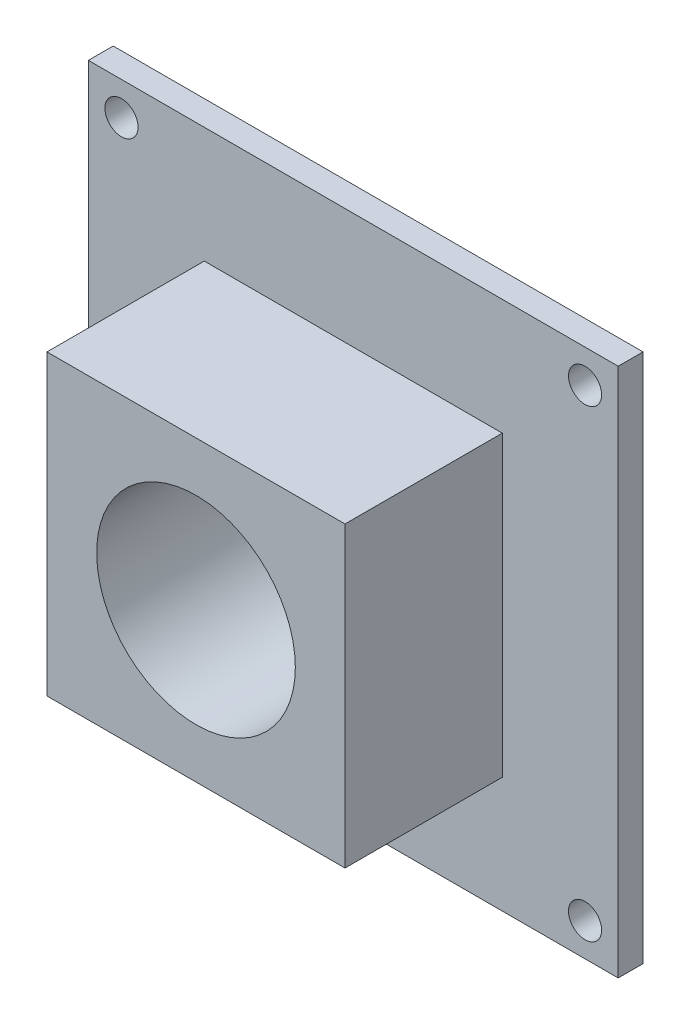
ISO-10303-21;
HEADER;
FILE_DESCRIPTION(('STEP AP214'),'2;1');
FILE_NAME('part.step','',(''),(''),'','','');
FILE_SCHEMA(('AUTOMOTIVE_DESIGN { 1 0 10303 214 1 1 1 1 }'));
ENDSEC;
DATA;
#1=APPLICATION_CONTEXT('core data for automotive mechanical design processes');
#2=APPLICATION_PROTOCOL_DEFINITION('international standard','automotive_design',2000,#1);
#3=PRODUCT_CONTEXT('',#1,'mechanical');
#4=PRODUCT('Part','Part','',(#3));
#5=PRODUCT_RELATED_PRODUCT_CATEGORY('part','',(#4));
#6=PRODUCT_DEFINITION_FORMATION('','',#4);
#7=PRODUCT_DEFINITION_CONTEXT('part definition',#1,'design');
#8=PRODUCT_DEFINITION('design','',#6,#7);
#9=PRODUCT_DEFINITION_SHAPE('','',#8);
#10=(LENGTH_UNIT() NAMED_UNIT(*) SI_UNIT(.MILLI.,.METRE.));
#11=(NAMED_UNIT(*) PLANE_ANGLE_UNIT() SI_UNIT($,.RADIAN.));
#12=(NAMED_UNIT(*) SI_UNIT($,.STERADIAN.) SOLID_ANGLE_UNIT());
#13=UNCERTAINTY_MEASURE_WITH_UNIT(LENGTH_MEASURE(1.E-05),#10,'distance_accuracy_value','');
#14=(GEOMETRIC_REPRESENTATION_CONTEXT(3) GLOBAL_UNCERTAINTY_ASSIGNED_CONTEXT((#13)) GLOBAL_UNIT_ASSIGNED_CONTEXT((#10,
#11,#12)) REPRESENTATION_CONTEXT('',''));
#15=CARTESIAN_POINT('',(0.,0.,0.));
#16=DIRECTION('',(0.,0.,1.));
#17=DIRECTION('',(1.,0.,0.));
#18=AXIS2_PLACEMENT_3D('',#15,#16,#17);
#19=CARTESIAN_POINT('',(0.,0.,1.5));
#20=DIRECTION('',(0.,0.,1.));
#21=DIRECTION('',(1.,0.,0.));
#22=AXIS2_PLACEMENT_3D('',#19,#20,#21);
#23=PLANE('',#22);
#24=DIRECTION('',(1.,0.,0.));
#25=VECTOR('',#24,1.);
#26=CARTESIAN_POINT('',(9.,-9.,1.5));
#27=LINE('',#26,#25);
#28=CARTESIAN_POINT('',(-9.,-9.00000000000001,1.5));
#29=VERTEX_POINT('',#28);
#30=CARTESIAN_POINT('',(9.,-9.,1.5));
#31=VERTEX_POINT('',#30);
#32=EDGE_CURVE('E358',#29,#31,#27,.T.);
#33=ORIENTED_EDGE('',*,*,#32,.F.);
#34=DIRECTION('',(0.,-1.,0.));
#35=VECTOR('',#34,1.);
#36=CARTESIAN_POINT('',(-9.,-9.00000000000001,1.5));
#37=LINE('',#36,#35);
#38=CARTESIAN_POINT('',(-9.,9.,1.5));
#39=VERTEX_POINT('',#38);
#40=EDGE_CURVE('E132',#39,#29,#37,.T.);
#41=ORIENTED_EDGE('',*,*,#40,.F.);
#42=DIRECTION('',(-1.,0.,0.));
#43=VECTOR('',#42,1.);
#44=CARTESIAN_POINT('',(9.,9.,1.5));
#45=LINE('',#44,#43);
#46=CARTESIAN_POINT('',(9.,9.,1.5));
#47=VERTEX_POINT('',#46);
#48=EDGE_CURVE('E128',#47,#39,#45,.T.);
#49=ORIENTED_EDGE('',*,*,#48,.F.);
#50=DIRECTION('',(0.,1.,0.));
#51=VECTOR('',#50,1.);
#52=CARTESIAN_POINT('',(9.,-9.,1.5));
#53=LINE('',#52,#51);
#54=EDGE_CURVE('E365',#31,#47,#53,.T.);
#55=ORIENTED_EDGE('',*,*,#54,.F.);
#56=EDGE_LOOP('',(#33,#41,#49,#55));
#57=FACE_BOUND('',#56,.T.);
#58=CARTESIAN_POINT('',(14.,-14.,1.5));
#59=DIRECTION('',(0.,0.,1.));
#60=DIRECTION('',(1.,0.,0.));
#61=AXIS2_PLACEMENT_3D('',#58,#59,#60);
#62=CIRCLE('',#61,1.);
#63=CARTESIAN_POINT('',(15.,-14.,1.5));
#64=VERTEX_POINT('',#63);
#65=EDGE_CURVE('E145',#64,#64,#62,.T.);
#66=ORIENTED_EDGE('',*,*,#65,.F.);
#67=EDGE_LOOP('',(#66));
#68=FACE_BOUND('',#67,.T.);
#69=CARTESIAN_POINT('',(-14.,14.,1.5));
#70=DIRECTION('',(0.,0.,1.));
#71=DIRECTION('',(1.,0.,0.));
#72=AXIS2_PLACEMENT_3D('',#69,#70,#71);
#73=CIRCLE('',#72,0.999999999999999);
#74=CARTESIAN_POINT('',(-13.,14.,1.5));
#75=VERTEX_POINT('',#74);
#76=EDGE_CURVE('E157',#75,#75,#73,.T.);
#77=ORIENTED_EDGE('',*,*,#76,.F.);
#78=EDGE_LOOP('',(#77));
#79=FACE_BOUND('',#78,.T.);
#80=DIRECTION('',(0.,-1.,0.));
#81=VECTOR('',#80,1.);
#82=CARTESIAN_POINT('',(-16.,-16.,1.5));
#83=LINE('',#82,#81);
#84=CARTESIAN_POINT('',(-16.,16.,1.5));
#85=VERTEX_POINT('',#84);
#86=CARTESIAN_POINT('',(-16.,-16.,1.5));
#87=VERTEX_POINT('',#86);
#88=EDGE_CURVE('E163',#85,#87,#83,.T.);
#89=ORIENTED_EDGE('',*,*,#88,.T.);
#90=DIRECTION('',(1.,0.,0.));
#91=VECTOR('',#90,1.);
#92=CARTESIAN_POINT('',(16.,-16.,1.5));
#93=LINE('',#92,#91);
#94=CARTESIAN_POINT('',(16.,-16.,1.5));
#95=VERTEX_POINT('',#94);
#96=EDGE_CURVE('E86',#87,#95,#93,.T.);
#97=ORIENTED_EDGE('',*,*,#96,.T.);
#98=DIRECTION('',(0.,1.,0.));
#99=VECTOR('',#98,1.);
#100=CARTESIAN_POINT('',(16.,-16.,1.5));
#101=LINE('',#100,#99);
#102=CARTESIAN_POINT('',(16.,16.,1.5));
#103=VERTEX_POINT('',#102);
#104=EDGE_CURVE('E166',#95,#103,#101,.T.);
#105=ORIENTED_EDGE('',*,*,#104,.T.);
#106=DIRECTION('',(-1.,0.,0.));
#107=VECTOR('',#106,1.);
#108=CARTESIAN_POINT('',(16.,16.,1.5));
#109=LINE('',#108,#107);
#110=EDGE_CURVE('E57',#103,#85,#109,.T.);
#111=ORIENTED_EDGE('',*,*,#110,.T.);
#112=EDGE_LOOP('',(#89,#97,#105,#111));
#113=FACE_BOUND('',#112,.T.);
#114=CARTESIAN_POINT('',(14.,14.,1.5));
#115=DIRECTION('',(0.,0.,1.));
#116=DIRECTION('',(1.,0.,0.));
#117=AXIS2_PLACEMENT_3D('',#114,#115,#116);
#118=CIRCLE('',#117,1.);
#119=CARTESIAN_POINT('',(15.,14.,1.5));
#120=VERTEX_POINT('',#119);
#121=EDGE_CURVE('E151',#120,#120,#118,.T.);
#122=ORIENTED_EDGE('',*,*,#121,.F.);
#123=EDGE_LOOP('',(#122));
#124=FACE_BOUND('',#123,.T.);
#125=CARTESIAN_POINT('',(-14.,-14.,1.5));
#126=DIRECTION('',(0.,0.,1.));
#127=DIRECTION('',(1.,0.,0.));
#128=AXIS2_PLACEMENT_3D('',#125,#126,#127);
#129=CIRCLE('',#128,0.999999999999999);
#130=CARTESIAN_POINT('',(-13.,-14.,1.5));
#131=VERTEX_POINT('',#130);
#132=EDGE_CURVE('E137',#131,#131,#129,.T.);
#133=ORIENTED_EDGE('',*,*,#132,.F.);
#134=EDGE_LOOP('',(#133));
#135=FACE_BOUND('',#134,.T.);
#136=ADVANCED_FACE('F33',(#57,#68,#79,#113,#124,#135),#23,.T.);
#137=CARTESIAN_POINT('',(0.,0.,0.));
#138=DIRECTION('',(0.,0.,1.));
#139=DIRECTION('',(1.,0.,0.));
#140=AXIS2_PLACEMENT_3D('',#137,#138,#139);
#141=PLANE('',#140);
#142=DIRECTION('',(0.,-1.,0.));
#143=VECTOR('',#142,1.);
#144=CARTESIAN_POINT('',(-16.,-16.,0.));
#145=LINE('',#144,#143);
#146=CARTESIAN_POINT('',(-16.,16.,0.));
#147=VERTEX_POINT('',#146);
#148=CARTESIAN_POINT('',(-16.,-16.,0.));
#149=VERTEX_POINT('',#148);
#150=EDGE_CURVE('E160',#147,#149,#145,.T.);
#151=ORIENTED_EDGE('',*,*,#150,.F.);
#152=DIRECTION('',(-1.,0.,0.));
#153=VECTOR('',#152,1.);
#154=CARTESIAN_POINT('',(16.,16.,0.));
#155=LINE('',#154,#153);
#156=CARTESIAN_POINT('',(16.,16.,0.));
#157=VERTEX_POINT('',#156);
#158=EDGE_CURVE('E78',#157,#147,#155,.T.);
#159=ORIENTED_EDGE('',*,*,#158,.F.);
#160=DIRECTION('',(0.,1.,0.));
#161=VECTOR('',#160,1.);
#162=CARTESIAN_POINT('',(16.,-16.,0.));
#163=LINE('',#162,#161);
#164=CARTESIAN_POINT('',(16.,-16.,0.));
#165=VERTEX_POINT('',#164);
#166=EDGE_CURVE('E174',#165,#157,#163,.T.);
#167=ORIENTED_EDGE('',*,*,#166,.F.);
#168=DIRECTION('',(1.,0.,0.));
#169=VECTOR('',#168,1.);
#170=CARTESIAN_POINT('',(16.,-16.,0.));
#171=LINE('',#170,#169);
#172=EDGE_CURVE('E172',#149,#165,#171,.T.);
#173=ORIENTED_EDGE('',*,*,#172,.F.);
#174=EDGE_LOOP('',(#151,#159,#167,#173));
#175=FACE_BOUND('',#174,.T.);
#176=CARTESIAN_POINT('',(-14.,14.,0.));
#177=DIRECTION('',(0.,0.,1.));
#178=DIRECTION('',(1.,0.,0.));
#179=AXIS2_PLACEMENT_3D('',#176,#177,#178);
#180=CIRCLE('',#179,0.999999999999999);
#181=CARTESIAN_POINT('',(-13.,14.,0.));
#182=VERTEX_POINT('',#181);
#183=EDGE_CURVE('E154',#182,#182,#180,.T.);
#184=ORIENTED_EDGE('',*,*,#183,.T.);
#185=EDGE_LOOP('',(#184));
#186=FACE_BOUND('',#185,.T.);
#187=CARTESIAN_POINT('',(14.,14.,0.));
#188=DIRECTION('',(0.,0.,1.));
#189=DIRECTION('',(1.,0.,0.));
#190=AXIS2_PLACEMENT_3D('',#187,#188,#189);
#191=CIRCLE('',#190,1.);
#192=CARTESIAN_POINT('',(15.,14.,0.));
#193=VERTEX_POINT('',#192);
#194=EDGE_CURVE('E148',#193,#193,#191,.T.);
#195=ORIENTED_EDGE('',*,*,#194,.T.);
#196=EDGE_LOOP('',(#195));
#197=FACE_BOUND('',#196,.T.);
#198=CARTESIAN_POINT('',(14.,-14.,0.));
#199=DIRECTION('',(0.,0.,1.));
#200=DIRECTION('',(1.,0.,0.));
#201=AXIS2_PLACEMENT_3D('',#198,#199,#200);
#202=CIRCLE('',#201,1.);
#203=CARTESIAN_POINT('',(15.,-14.,0.));
#204=VERTEX_POINT('',#203);
#205=EDGE_CURVE('E143',#204,#204,#202,.T.);
#206=ORIENTED_EDGE('',*,*,#205,.T.);
#207=EDGE_LOOP('',(#206));
#208=FACE_BOUND('',#207,.T.);
#209=CARTESIAN_POINT('',(-14.,-14.,0.));
#210=DIRECTION('',(0.,0.,1.));
#211=DIRECTION('',(1.,0.,0.));
#212=AXIS2_PLACEMENT_3D('',#209,#210,#211);
#213=CIRCLE('',#212,0.999999999999999);
#214=CARTESIAN_POINT('',(-13.,-14.,0.));
#215=VERTEX_POINT('',#214);
#216=EDGE_CURVE('E134',#215,#215,#213,.T.);
#217=ORIENTED_EDGE('',*,*,#216,.T.);
#218=EDGE_LOOP('',(#217));
#219=FACE_BOUND('',#218,.T.);
#220=ADVANCED_FACE('F188',(#175,#186,#197,#208,#219),#141,.F.);
#221=CARTESIAN_POINT('',(-16.,-16.,1.5));
#222=DIRECTION('',(1.,0.,0.));
#223=DIRECTION('',(0.,0.,-1.));
#224=AXIS2_PLACEMENT_3D('',#221,#222,#223);
#225=PLANE('',#224);
#226=ORIENTED_EDGE('',*,*,#150,.T.);
#227=DIRECTION('',(0.,0.,-1.));
#228=VECTOR('',#227,1.);
#229=CARTESIAN_POINT('',(-16.,-16.,1.5));
#230=LINE('',#229,#228);
#231=EDGE_CURVE('E41',#87,#149,#230,.T.);
#232=ORIENTED_EDGE('',*,*,#231,.F.);
#233=ORIENTED_EDGE('',*,*,#88,.F.);
#234=DIRECTION('',(0.,0.,-1.));
#235=VECTOR('',#234,1.);
#236=CARTESIAN_POINT('',(-16.,16.,1.5));
#237=LINE('',#236,#235);
#238=EDGE_CURVE('E169',#85,#147,#237,.T.);
#239=ORIENTED_EDGE('',*,*,#238,.T.);
#240=EDGE_LOOP('',(#226,#232,#233,#239));
#241=FACE_BOUND('',#240,.T.);
#242=ADVANCED_FACE('F35',(#241),#225,.F.);
#243=CARTESIAN_POINT('',(16.,-16.,1.5));
#244=DIRECTION('',(0.,1.,0.));
#245=DIRECTION('',(-1.,0.,0.));
#246=AXIS2_PLACEMENT_3D('',#243,#244,#245);
#247=PLANE('',#246);
#248=ORIENTED_EDGE('',*,*,#172,.T.);
#249=DIRECTION('',(0.,0.,-1.));
#250=VECTOR('',#249,1.);
#251=CARTESIAN_POINT('',(16.,-16.,1.5));
#252=LINE('',#251,#250);
#253=EDGE_CURVE('E180',#95,#165,#252,.T.);
#254=ORIENTED_EDGE('',*,*,#253,.F.);
#255=ORIENTED_EDGE('',*,*,#96,.F.);
#256=ORIENTED_EDGE('',*,*,#231,.T.);
#257=EDGE_LOOP('',(#248,#254,#255,#256));
#258=FACE_BOUND('',#257,.T.);
#259=ADVANCED_FACE('F183',(#258),#247,.F.);
#260=CARTESIAN_POINT('',(16.,-16.,1.5));
#261=DIRECTION('',(-1.,0.,0.));
#262=DIRECTION('',(0.,0.,1.));
#263=AXIS2_PLACEMENT_3D('',#260,#261,#262);
#264=PLANE('',#263);
#265=ORIENTED_EDGE('',*,*,#166,.T.);
#266=DIRECTION('',(0.,0.,-1.));
#267=VECTOR('',#266,1.);
#268=CARTESIAN_POINT('',(16.,16.,1.5));
#269=LINE('',#268,#267);
#270=EDGE_CURVE('E178',#103,#157,#269,.T.);
#271=ORIENTED_EDGE('',*,*,#270,.F.);
#272=ORIENTED_EDGE('',*,*,#104,.F.);
#273=ORIENTED_EDGE('',*,*,#253,.T.);
#274=EDGE_LOOP('',(#265,#271,#272,#273));
#275=FACE_BOUND('',#274,.T.);
#276=ADVANCED_FACE('F193',(#275),#264,.F.);
#277=CARTESIAN_POINT('',(16.,16.,1.5));
#278=DIRECTION('',(0.,-1.,0.));
#279=DIRECTION('',(1.,0.,0.));
#280=AXIS2_PLACEMENT_3D('',#277,#278,#279);
#281=PLANE('',#280);
#282=ORIENTED_EDGE('',*,*,#158,.T.);
#283=ORIENTED_EDGE('',*,*,#238,.F.);
#284=ORIENTED_EDGE('',*,*,#110,.F.);
#285=ORIENTED_EDGE('',*,*,#270,.T.);
#286=EDGE_LOOP('',(#282,#283,#284,#285));
#287=FACE_BOUND('',#286,.T.);
#288=ADVANCED_FACE('F195',(#287),#281,.F.);
#289=CARTESIAN_POINT('',(-14.,14.,1.5));
#290=DIRECTION('',(0.,0.,-1.));
#291=DIRECTION('',(-1.,0.,0.));
#292=AXIS2_PLACEMENT_3D('',#289,#290,#291);
#293=CYLINDRICAL_SURFACE('',#292,0.999999999999999);
#294=ORIENTED_EDGE('',*,*,#76,.T.);
#295=EDGE_LOOP('',(#294));
#296=FACE_BOUND('',#295,.T.);
#297=ORIENTED_EDGE('',*,*,#183,.F.);
#298=EDGE_LOOP('',(#297));
#299=FACE_BOUND('',#298,.T.);
#300=ADVANCED_FACE('F221',(#296,#299),#293,.F.);
#301=CARTESIAN_POINT('',(14.,14.,1.5));
#302=DIRECTION('',(0.,0.,-1.));
#303=DIRECTION('',(-1.,0.,0.));
#304=AXIS2_PLACEMENT_3D('',#301,#302,#303);
#305=CYLINDRICAL_SURFACE('',#304,1.);
#306=ORIENTED_EDGE('',*,*,#121,.T.);
#307=EDGE_LOOP('',(#306));
#308=FACE_BOUND('',#307,.T.);
#309=ORIENTED_EDGE('',*,*,#194,.F.);
#310=EDGE_LOOP('',(#309));
#311=FACE_BOUND('',#310,.T.);
#312=ADVANCED_FACE('F242',(#308,#311),#305,.F.);
#313=CARTESIAN_POINT('',(14.,-14.,1.5));
#314=DIRECTION('',(0.,0.,-1.));
#315=DIRECTION('',(-1.,0.,0.));
#316=AXIS2_PLACEMENT_3D('',#313,#314,#315);
#317=CYLINDRICAL_SURFACE('',#316,1.);
#318=ORIENTED_EDGE('',*,*,#65,.T.);
#319=EDGE_LOOP('',(#318));
#320=FACE_BOUND('',#319,.T.);
#321=ORIENTED_EDGE('',*,*,#205,.F.);
#322=EDGE_LOOP('',(#321));
#323=FACE_BOUND('',#322,.T.);
#324=ADVANCED_FACE('F208',(#320,#323),#317,.F.);
#325=CARTESIAN_POINT('',(-14.,-14.,1.5));
#326=DIRECTION('',(0.,0.,-1.));
#327=DIRECTION('',(-1.,0.,0.));
#328=AXIS2_PLACEMENT_3D('',#325,#326,#327);
#329=CYLINDRICAL_SURFACE('',#328,0.999999999999999);
#330=ORIENTED_EDGE('',*,*,#132,.T.);
#331=EDGE_LOOP('',(#330));
#332=FACE_BOUND('',#331,.T.);
#333=ORIENTED_EDGE('',*,*,#216,.F.);
#334=EDGE_LOOP('',(#333));
#335=FACE_BOUND('',#334,.T.);
#336=ADVANCED_FACE('F205',(#332,#335),#329,.F.);
#337=CARTESIAN_POINT('',(0.,0.,11.));
#338=DIRECTION('',(0.,0.,1.));
#339=DIRECTION('',(1.,0.,0.));
#340=AXIS2_PLACEMENT_3D('',#337,#338,#339);
#341=PLANE('',#340);
#342=DIRECTION('',(0.,-1.,0.));
#343=VECTOR('',#342,1.);
#344=CARTESIAN_POINT('',(-9.,-9.00000000000001,11.));
#345=LINE('',#344,#343);
#346=CARTESIAN_POINT('',(-9.,9.,11.));
#347=VERTEX_POINT('',#346);
#348=CARTESIAN_POINT('',(-9.,-9.00000000000001,11.));
#349=VERTEX_POINT('',#348);
#350=EDGE_CURVE('E119',#347,#349,#345,.T.);
#351=ORIENTED_EDGE('',*,*,#350,.T.);
#352=DIRECTION('',(1.,0.,0.));
#353=VECTOR('',#352,1.);
#354=CARTESIAN_POINT('',(9.,-9.,11.));
#355=LINE('',#354,#353);
#356=CARTESIAN_POINT('',(9.,-9.,11.));
#357=VERTEX_POINT('',#356);
#358=EDGE_CURVE('E108',#349,#357,#355,.T.);
#359=ORIENTED_EDGE('',*,*,#358,.T.);
#360=DIRECTION('',(0.,1.,0.));
#361=VECTOR('',#360,1.);
#362=CARTESIAN_POINT('',(9.,-9.,11.));
#363=LINE('',#362,#361);
#364=CARTESIAN_POINT('',(9.,9.,11.));
#365=VERTEX_POINT('',#364);
#366=EDGE_CURVE('E118',#357,#365,#363,.T.);
#367=ORIENTED_EDGE('',*,*,#366,.T.);
#368=DIRECTION('',(-1.,0.,0.));
#369=VECTOR('',#368,1.);
#370=CARTESIAN_POINT('',(9.,9.,11.));
#371=LINE('',#370,#369);
#372=EDGE_CURVE('E124',#365,#347,#371,.T.);
#373=ORIENTED_EDGE('',*,*,#372,.T.);
#374=EDGE_LOOP('',(#351,#359,#367,#373));
#375=FACE_BOUND('',#374,.T.);
#376=CARTESIAN_POINT('',(0.,0.,11.));
#377=DIRECTION('',(0.,0.,1.));
#378=DIRECTION('',(1.,0.,0.));
#379=AXIS2_PLACEMENT_3D('',#376,#377,#378);
#380=CIRCLE('',#379,6.);
#381=CARTESIAN_POINT('',(6.,0.,11.));
#382=VERTEX_POINT('',#381);
#383=EDGE_CURVE('E356',#382,#382,#380,.T.);
#384=ORIENTED_EDGE('',*,*,#383,.F.);
#385=EDGE_LOOP('',(#384));
#386=FACE_BOUND('',#385,.T.);
#387=ADVANCED_FACE('F122',(#375,#386),#341,.T.);
#388=CARTESIAN_POINT('',(-9.,-9.00000000000001,11.));
#389=DIRECTION('',(1.,0.,0.));
#390=DIRECTION('',(0.,0.,-1.));
#391=AXIS2_PLACEMENT_3D('',#388,#389,#390);
#392=PLANE('',#391);
#393=ORIENTED_EDGE('',*,*,#40,.T.);
#394=DIRECTION('',(0.,0.,-1.));
#395=VECTOR('',#394,1.);
#396=CARTESIAN_POINT('',(-9.,-9.00000000000001,11.));
#397=LINE('',#396,#395);
#398=EDGE_CURVE('E112',#349,#29,#397,.T.);
#399=ORIENTED_EDGE('',*,*,#398,.F.);
#400=ORIENTED_EDGE('',*,*,#350,.F.);
#401=DIRECTION('',(0.,0.,-1.));
#402=VECTOR('',#401,1.);
#403=CARTESIAN_POINT('',(-9.,9.,11.));
#404=LINE('',#403,#402);
#405=EDGE_CURVE('E362',#347,#39,#404,.T.);
#406=ORIENTED_EDGE('',*,*,#405,.T.);
#407=EDGE_LOOP('',(#393,#399,#400,#406));
#408=FACE_BOUND('',#407,.T.);
#409=ADVANCED_FACE('F130',(#408),#392,.F.);
#410=CARTESIAN_POINT('',(9.,-9.,11.));
#411=DIRECTION('',(0.,1.,0.));
#412=DIRECTION('',(-1.,0.,0.));
#413=AXIS2_PLACEMENT_3D('',#410,#411,#412);
#414=PLANE('',#413);
#415=ORIENTED_EDGE('',*,*,#32,.T.);
#416=DIRECTION('',(0.,0.,-1.));
#417=VECTOR('',#416,1.);
#418=CARTESIAN_POINT('',(9.,-9.,11.));
#419=LINE('',#418,#417);
#420=EDGE_CURVE('E115',#357,#31,#419,.T.);
#421=ORIENTED_EDGE('',*,*,#420,.F.);
#422=ORIENTED_EDGE('',*,*,#358,.F.);
#423=ORIENTED_EDGE('',*,*,#398,.T.);
#424=EDGE_LOOP('',(#415,#421,#422,#423));
#425=FACE_BOUND('',#424,.T.);
#426=ADVANCED_FACE('F110',(#425),#414,.F.);
#427=CARTESIAN_POINT('',(9.,-9.,11.));
#428=DIRECTION('',(-1.,0.,0.));
#429=DIRECTION('',(0.,0.,1.));
#430=AXIS2_PLACEMENT_3D('',#427,#428,#429);
#431=PLANE('',#430);
#432=ORIENTED_EDGE('',*,*,#54,.T.);
#433=DIRECTION('',(0.,0.,-1.));
#434=VECTOR('',#433,1.);
#435=CARTESIAN_POINT('',(9.,9.,11.));
#436=LINE('',#435,#434);
#437=EDGE_CURVE('E48',#365,#47,#436,.T.);
#438=ORIENTED_EDGE('',*,*,#437,.F.);
#439=ORIENTED_EDGE('',*,*,#366,.F.);
#440=ORIENTED_EDGE('',*,*,#420,.T.);
#441=EDGE_LOOP('',(#432,#438,#439,#440));
#442=FACE_BOUND('',#441,.T.);
#443=ADVANCED_FACE('F280',(#442),#431,.F.);
#444=CARTESIAN_POINT('',(9.,9.,11.));
#445=DIRECTION('',(0.,-1.,0.));
#446=DIRECTION('',(1.,0.,0.));
#447=AXIS2_PLACEMENT_3D('',#444,#445,#446);
#448=PLANE('',#447);
#449=ORIENTED_EDGE('',*,*,#48,.T.);
#450=ORIENTED_EDGE('',*,*,#405,.F.);
#451=ORIENTED_EDGE('',*,*,#372,.F.);
#452=ORIENTED_EDGE('',*,*,#437,.T.);
#453=EDGE_LOOP('',(#449,#450,#451,#452));
#454=FACE_BOUND('',#453,.T.);
#455=ADVANCED_FACE('F287',(#454),#448,.F.);
#456=CARTESIAN_POINT('',(0.,0.,11.));
#457=DIRECTION('',(0.,0.,-1.));
#458=DIRECTION('',(-1.,0.,0.));
#459=AXIS2_PLACEMENT_3D('',#456,#457,#458);
#460=CYLINDRICAL_SURFACE('',#459,6.);
#461=ORIENTED_EDGE('',*,*,#383,.T.);
#462=EDGE_LOOP('',(#461));
#463=FACE_BOUND('',#462,.T.);
#464=CARTESIAN_POINT('',(0.,0.,1.5));
#465=DIRECTION('',(0.,0.,1.));
#466=DIRECTION('',(1.,0.,0.));
#467=AXIS2_PLACEMENT_3D('',#464,#465,#466);
#468=CIRCLE('',#467,6.);
#469=CARTESIAN_POINT('',(6.,0.,1.5));
#470=VERTEX_POINT('',#469);
#471=EDGE_CURVE('E11',#470,#470,#468,.F.);
#472=ORIENTED_EDGE('',*,*,#471,.T.);
#473=EDGE_LOOP('',(#472));
#474=FACE_BOUND('',#473,.T.);
#475=ADVANCED_FACE('F295',(#463,#474),#460,.F.);
#476=ORIENTED_EDGE('',*,*,#471,.F.);
#477=EDGE_LOOP('',(#476));
#478=FACE_BOUND('',#477,.T.);
#479=ADVANCED_FACE('F200',(#478),#23,.T.);
#480=CLOSED_SHELL('',(#136,#220,#242,#259,#276,#288,#300,#312,#324,#336,#387,#409,#426,#443,
#455,#475,#479));
#481=MANIFOLD_SOLID_BREP('B2',#480);
#482=ADVANCED_BREP_SHAPE_REPRESENTATION('',(#18,#481),#14);
#483=SHAPE_DEFINITION_REPRESENTATION(#9,#482);
ENDSEC;
END-ISO-10303-21;
